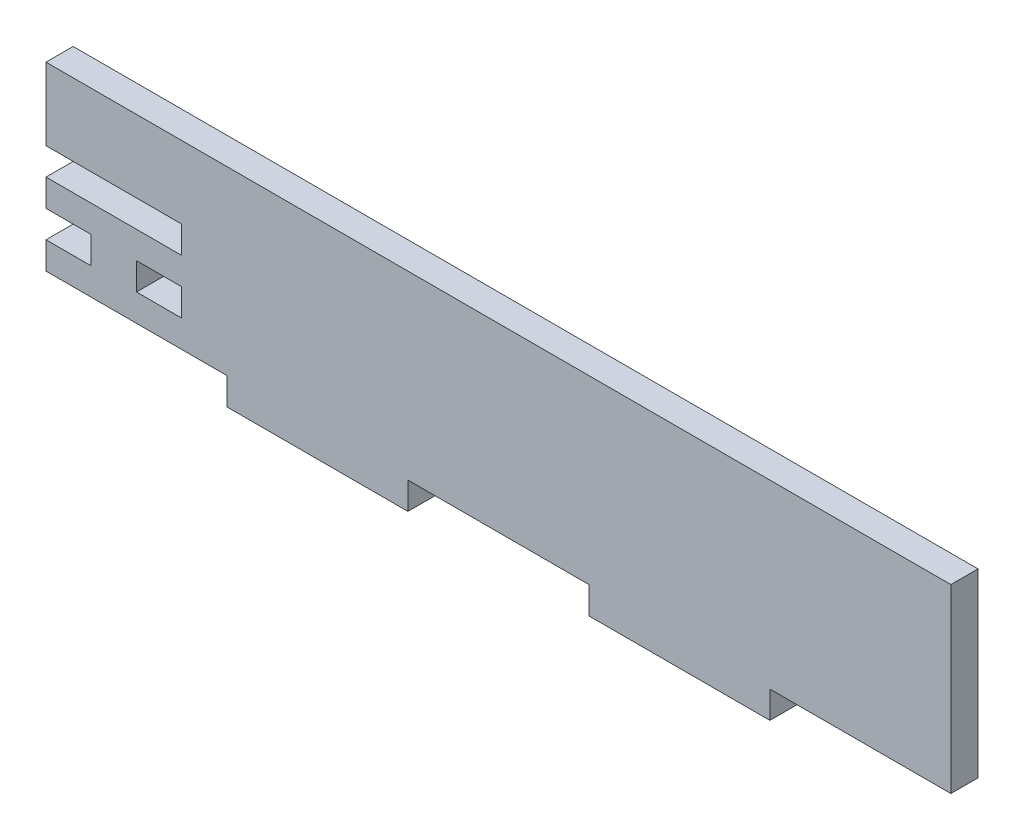
ISO-10303-21;
HEADER;
FILE_DESCRIPTION(('STEP AP214'),'2;1');
FILE_NAME('part.step','',(''),(''),'','','');
FILE_SCHEMA(('AUTOMOTIVE_DESIGN { 1 0 10303 214 1 1 1 1 }'));
ENDSEC;
DATA;
#1=APPLICATION_CONTEXT('core data for automotive mechanical design processes');
#2=APPLICATION_PROTOCOL_DEFINITION('international standard','automotive_design',2000,#1);
#3=PRODUCT_CONTEXT('',#1,'mechanical');
#4=PRODUCT('Part','Part','',(#3));
#5=PRODUCT_RELATED_PRODUCT_CATEGORY('part','',(#4));
#6=PRODUCT_DEFINITION_FORMATION('','',#4);
#7=PRODUCT_DEFINITION_CONTEXT('part definition',#1,'design');
#8=PRODUCT_DEFINITION('design','',#6,#7);
#9=PRODUCT_DEFINITION_SHAPE('','',#8);
#10=(LENGTH_UNIT() NAMED_UNIT(*) SI_UNIT(.MILLI.,.METRE.));
#11=(NAMED_UNIT(*) PLANE_ANGLE_UNIT() SI_UNIT($,.RADIAN.));
#12=(NAMED_UNIT(*) SI_UNIT($,.STERADIAN.) SOLID_ANGLE_UNIT());
#13=UNCERTAINTY_MEASURE_WITH_UNIT(LENGTH_MEASURE(1.E-05),#10,'distance_accuracy_value','');
#14=(GEOMETRIC_REPRESENTATION_CONTEXT(3) GLOBAL_UNCERTAINTY_ASSIGNED_CONTEXT((#13)) GLOBAL_UNIT_ASSIGNED_CONTEXT((#10,
#11,#12)) REPRESENTATION_CONTEXT('',''));
#15=CARTESIAN_POINT('',(0.,0.,0.));
#16=DIRECTION('',(0.,0.,1.));
#17=DIRECTION('',(1.,0.,0.));
#18=AXIS2_PLACEMENT_3D('',#15,#16,#17);
#19=CARTESIAN_POINT('',(-100.,23.,6.));
#20=DIRECTION('',(1.,0.,0.));
#21=DIRECTION('',(0.,0.,-1.));
#22=AXIS2_PLACEMENT_3D('',#19,#20,#21);
#23=PLANE('',#22);
#24=DIRECTION('',(0.,-1.,0.));
#25=VECTOR('',#24,1.);
#26=CARTESIAN_POINT('',(-100.,23.,0.));
#27=LINE('',#26,#25);
#28=CARTESIAN_POINT('',(-100.,23.,0.));
#29=VERTEX_POINT('',#28);
#30=CARTESIAN_POINT('',(-100.,7.,0.));
#31=VERTEX_POINT('',#30);
#32=EDGE_CURVE('E251',#29,#31,#27,.T.);
#33=ORIENTED_EDGE('',*,*,#32,.T.);
#34=DIRECTION('',(0.,0.,1.));
#35=VECTOR('',#34,1.);
#36=CARTESIAN_POINT('',(-100.,7.,-4.));
#37=LINE('',#36,#35);
#38=CARTESIAN_POINT('',(-100.,7.,6.));
#39=VERTEX_POINT('',#38);
#40=EDGE_CURVE('E309',#31,#39,#37,.T.);
#41=ORIENTED_EDGE('',*,*,#40,.T.);
#42=DIRECTION('',(0.,-1.,0.));
#43=VECTOR('',#42,1.);
#44=CARTESIAN_POINT('',(-100.,23.,6.));
#45=LINE('',#44,#43);
#46=CARTESIAN_POINT('',(-100.,23.,6.));
#47=VERTEX_POINT('',#46);
#48=EDGE_CURVE('E228',#47,#39,#45,.T.);
#49=ORIENTED_EDGE('',*,*,#48,.F.);
#50=DIRECTION('',(0.,0.,-1.));
#51=VECTOR('',#50,1.);
#52=CARTESIAN_POINT('',(-100.,23.,6.));
#53=LINE('',#52,#51);
#54=EDGE_CURVE('E261',#47,#29,#53,.T.);
#55=ORIENTED_EDGE('',*,*,#54,.T.);
#56=EDGE_LOOP('',(#33,#41,#49,#55));
#57=FACE_BOUND('',#56,.T.);
#58=ADVANCED_FACE('F38',(#57),#23,.F.);
#59=CARTESIAN_POINT('',(-100.,0.999999999999994,6.));
#60=VERTEX_POINT('',#59);
#61=CARTESIAN_POINT('',(-100.,-5.00000000000001,6.));
#62=VERTEX_POINT('',#61);
#63=EDGE_CURVE('E217',#60,#62,#45,.T.);
#64=ORIENTED_EDGE('',*,*,#63,.F.);
#65=DIRECTION('',(0.,0.,1.));
#66=VECTOR('',#65,1.);
#67=CARTESIAN_POINT('',(-100.,0.999999999999994,-4.));
#68=LINE('',#67,#66);
#69=CARTESIAN_POINT('',(-100.,0.999999999999994,0.));
#70=VERTEX_POINT('',#69);
#71=EDGE_CURVE('E199',#70,#60,#68,.T.);
#72=ORIENTED_EDGE('',*,*,#71,.F.);
#73=CARTESIAN_POINT('',(-100.,-5.00000000000001,0.));
#74=VERTEX_POINT('',#73);
#75=EDGE_CURVE('E256',#70,#74,#27,.T.);
#76=ORIENTED_EDGE('',*,*,#75,.T.);
#77=DIRECTION('',(0.,0.,1.));
#78=VECTOR('',#77,1.);
#79=CARTESIAN_POINT('',(-100.,-5.00000000000001,-4.));
#80=LINE('',#79,#78);
#81=EDGE_CURVE('E226',#74,#62,#80,.T.);
#82=ORIENTED_EDGE('',*,*,#81,.T.);
#83=EDGE_LOOP('',(#64,#72,#76,#82));
#84=FACE_BOUND('',#83,.T.);
#85=ADVANCED_FACE('F224',(#84),#23,.F.);
#86=CARTESIAN_POINT('',(-100.,-23.,6.));
#87=DIRECTION('',(0.,1.,0.));
#88=DIRECTION('',(0.,0.,1.));
#89=AXIS2_PLACEMENT_3D('',#86,#87,#88);
#90=PLANE('',#89);
#91=DIRECTION('',(1.,0.,0.));
#92=VECTOR('',#91,1.);
#93=CARTESIAN_POINT('',(-100.,-23.,6.));
#94=LINE('',#93,#92);
#95=CARTESIAN_POINT('',(-60.,-23.,6.));
#96=VERTEX_POINT('',#95);
#97=CARTESIAN_POINT('',(-20.,-23.,6.));
#98=VERTEX_POINT('',#97);
#99=EDGE_CURVE('E242',#96,#98,#94,.T.);
#100=ORIENTED_EDGE('',*,*,#99,.F.);
#101=DIRECTION('',(0.,0.,1.));
#102=VECTOR('',#101,1.);
#103=CARTESIAN_POINT('',(-60.,-23.,0.));
#104=LINE('',#103,#102);
#105=CARTESIAN_POINT('',(-60.,-23.,0.));
#106=VERTEX_POINT('',#105);
#107=EDGE_CURVE('E376',#106,#96,#104,.T.);
#108=ORIENTED_EDGE('',*,*,#107,.F.);
#109=DIRECTION('',(1.,0.,0.));
#110=VECTOR('',#109,1.);
#111=CARTESIAN_POINT('',(-100.,-23.,0.));
#112=LINE('',#111,#110);
#113=CARTESIAN_POINT('',(-20.,-23.,0.));
#114=VERTEX_POINT('',#113);
#115=EDGE_CURVE('E260',#106,#114,#112,.T.);
#116=ORIENTED_EDGE('',*,*,#115,.T.);
#117=DIRECTION('',(0.,0.,1.));
#118=VECTOR('',#117,1.);
#119=CARTESIAN_POINT('',(-20.,-23.,0.));
#120=LINE('',#119,#118);
#121=EDGE_CURVE('E381',#114,#98,#120,.T.);
#122=ORIENTED_EDGE('',*,*,#121,.T.);
#123=EDGE_LOOP('',(#100,#108,#116,#122));
#124=FACE_BOUND('',#123,.T.);
#125=ADVANCED_FACE('F463',(#124),#90,.F.);
#126=CARTESIAN_POINT('',(100.,23.,6.));
#127=DIRECTION('',(-1.,0.,0.));
#128=DIRECTION('',(0.,0.,1.));
#129=AXIS2_PLACEMENT_3D('',#126,#127,#128);
#130=PLANE('',#129);
#131=DIRECTION('',(0.,1.,0.));
#132=VECTOR('',#131,1.);
#133=CARTESIAN_POINT('',(100.,23.,6.));
#134=LINE('',#133,#132);
#135=CARTESIAN_POINT('',(100.,-17.,6.));
#136=VERTEX_POINT('',#135);
#137=CARTESIAN_POINT('',(100.,23.,6.));
#138=VERTEX_POINT('',#137);
#139=EDGE_CURVE('E451',#136,#138,#134,.T.);
#140=ORIENTED_EDGE('',*,*,#139,.F.);
#141=DIRECTION('',(0.,0.,1.));
#142=VECTOR('',#141,1.);
#143=CARTESIAN_POINT('',(100.,-17.,0.));
#144=LINE('',#143,#142);
#145=CARTESIAN_POINT('',(100.,-17.,0.));
#146=VERTEX_POINT('',#145);
#147=EDGE_CURVE('E438',#146,#136,#144,.T.);
#148=ORIENTED_EDGE('',*,*,#147,.F.);
#149=DIRECTION('',(0.,1.,0.));
#150=VECTOR('',#149,1.);
#151=CARTESIAN_POINT('',(100.,23.,0.));
#152=LINE('',#151,#150);
#153=CARTESIAN_POINT('',(100.,23.,0.));
#154=VERTEX_POINT('',#153);
#155=EDGE_CURVE('E243',#146,#154,#152,.T.);
#156=ORIENTED_EDGE('',*,*,#155,.T.);
#157=DIRECTION('',(0.,0.,-1.));
#158=VECTOR('',#157,1.);
#159=CARTESIAN_POINT('',(100.,23.,6.));
#160=LINE('',#159,#158);
#161=EDGE_CURVE('E265',#138,#154,#160,.T.);
#162=ORIENTED_EDGE('',*,*,#161,.F.);
#163=EDGE_LOOP('',(#140,#148,#156,#162));
#164=FACE_BOUND('',#163,.T.);
#165=ADVANCED_FACE('F40',(#164),#130,.F.);
#166=CARTESIAN_POINT('',(-100.,23.,6.));
#167=DIRECTION('',(0.,-1.,0.));
#168=DIRECTION('',(0.,0.,-1.));
#169=AXIS2_PLACEMENT_3D('',#166,#167,#168);
#170=PLANE('',#169);
#171=DIRECTION('',(-1.,0.,0.));
#172=VECTOR('',#171,1.);
#173=CARTESIAN_POINT('',(-100.,23.,0.));
#174=LINE('',#173,#172);
#175=EDGE_CURVE('E246',#154,#29,#174,.T.);
#176=ORIENTED_EDGE('',*,*,#175,.T.);
#177=ORIENTED_EDGE('',*,*,#54,.F.);
#178=DIRECTION('',(-1.,0.,0.));
#179=VECTOR('',#178,1.);
#180=CARTESIAN_POINT('',(-100.,23.,6.));
#181=LINE('',#180,#179);
#182=EDGE_CURVE('E235',#138,#47,#181,.T.);
#183=ORIENTED_EDGE('',*,*,#182,.F.);
#184=ORIENTED_EDGE('',*,*,#161,.T.);
#185=EDGE_LOOP('',(#176,#177,#183,#184));
#186=FACE_BOUND('',#185,.T.);
#187=ADVANCED_FACE('F517',(#186),#170,.F.);
#188=CARTESIAN_POINT('',(-100.,-11.,6.));
#189=VERTEX_POINT('',#188);
#190=CARTESIAN_POINT('',(-100.,-17.,6.));
#191=VERTEX_POINT('',#190);
#192=EDGE_CURVE('E229',#189,#191,#45,.T.);
#193=ORIENTED_EDGE('',*,*,#192,.F.);
#194=DIRECTION('',(0.,0.,1.));
#195=VECTOR('',#194,1.);
#196=CARTESIAN_POINT('',(-100.,-11.,-4.));
#197=LINE('',#196,#195);
#198=CARTESIAN_POINT('',(-100.,-11.,0.));
#199=VERTEX_POINT('',#198);
#200=EDGE_CURVE('E330',#199,#189,#197,.T.);
#201=ORIENTED_EDGE('',*,*,#200,.F.);
#202=CARTESIAN_POINT('',(-100.,-17.,0.));
#203=VERTEX_POINT('',#202);
#204=EDGE_CURVE('E250',#199,#203,#27,.T.);
#205=ORIENTED_EDGE('',*,*,#204,.T.);
#206=DIRECTION('',(0.,0.,1.));
#207=VECTOR('',#206,1.);
#208=CARTESIAN_POINT('',(-100.,-17.,0.));
#209=LINE('',#208,#207);
#210=EDGE_CURVE('E247',#203,#191,#209,.T.);
#211=ORIENTED_EDGE('',*,*,#210,.T.);
#212=EDGE_LOOP('',(#193,#201,#205,#211));
#213=FACE_BOUND('',#212,.T.);
#214=ADVANCED_FACE('F495',(#213),#23,.F.);
#215=CARTESIAN_POINT('',(20.,-23.,6.));
#216=VERTEX_POINT('',#215);
#217=CARTESIAN_POINT('',(60.,-23.,6.));
#218=VERTEX_POINT('',#217);
#219=EDGE_CURVE('E234',#216,#218,#94,.T.);
#220=ORIENTED_EDGE('',*,*,#219,.F.);
#221=DIRECTION('',(0.,0.,1.));
#222=VECTOR('',#221,1.);
#223=CARTESIAN_POINT('',(20.,-23.,0.));
#224=LINE('',#223,#222);
#225=CARTESIAN_POINT('',(20.,-23.,0.));
#226=VERTEX_POINT('',#225);
#227=EDGE_CURVE('E406',#226,#216,#224,.T.);
#228=ORIENTED_EDGE('',*,*,#227,.F.);
#229=CARTESIAN_POINT('',(60.,-23.,0.));
#230=VERTEX_POINT('',#229);
#231=EDGE_CURVE('E255',#226,#230,#112,.T.);
#232=ORIENTED_EDGE('',*,*,#231,.T.);
#233=DIRECTION('',(0.,0.,1.));
#234=VECTOR('',#233,1.);
#235=CARTESIAN_POINT('',(60.,-23.,0.));
#236=LINE('',#235,#234);
#237=EDGE_CURVE('E412',#230,#218,#236,.T.);
#238=ORIENTED_EDGE('',*,*,#237,.T.);
#239=EDGE_LOOP('',(#220,#228,#232,#238));
#240=FACE_BOUND('',#239,.T.);
#241=ADVANCED_FACE('F516',(#240),#90,.F.);
#242=CARTESIAN_POINT('',(0.,0.,6.));
#243=DIRECTION('',(0.,0.,1.));
#244=DIRECTION('',(1.,0.,0.));
#245=AXIS2_PLACEMENT_3D('',#242,#243,#244);
#246=PLANE('',#245);
#247=DIRECTION('',(-1.,0.,0.));
#248=VECTOR('',#247,1.);
#249=CARTESIAN_POINT('',(-100.,7.,6.));
#250=LINE('',#249,#248);
#251=CARTESIAN_POINT('',(-70.,6.99999999999999,6.));
#252=VERTEX_POINT('',#251);
#253=EDGE_CURVE('E210',#252,#39,#250,.T.);
#254=ORIENTED_EDGE('',*,*,#253,.F.);
#255=DIRECTION('',(0.,1.,0.));
#256=VECTOR('',#255,1.);
#257=CARTESIAN_POINT('',(-70.,6.99999999999999,6.));
#258=LINE('',#257,#256);
#259=CARTESIAN_POINT('',(-70.,0.999999999999994,6.));
#260=VERTEX_POINT('',#259);
#261=EDGE_CURVE('E220',#260,#252,#258,.T.);
#262=ORIENTED_EDGE('',*,*,#261,.F.);
#263=DIRECTION('',(1.,0.,0.));
#264=VECTOR('',#263,1.);
#265=CARTESIAN_POINT('',(-100.,0.999999999999994,6.));
#266=LINE('',#265,#264);
#267=EDGE_CURVE('E202',#60,#260,#266,.T.);
#268=ORIENTED_EDGE('',*,*,#267,.F.);
#269=ORIENTED_EDGE('',*,*,#63,.T.);
#270=DIRECTION('',(-1.,0.,0.));
#271=VECTOR('',#270,1.);
#272=CARTESIAN_POINT('',(-100.,-5.00000000000001,6.));
#273=LINE('',#272,#271);
#274=CARTESIAN_POINT('',(-90.,-5.00000000000001,6.));
#275=VERTEX_POINT('',#274);
#276=EDGE_CURVE('E327',#275,#62,#273,.T.);
#277=ORIENTED_EDGE('',*,*,#276,.F.);
#278=DIRECTION('',(0.,1.,0.));
#279=VECTOR('',#278,1.);
#280=CARTESIAN_POINT('',(-90.,-11.,6.));
#281=LINE('',#280,#279);
#282=CARTESIAN_POINT('',(-90.,-11.,6.));
#283=VERTEX_POINT('',#282);
#284=EDGE_CURVE('E322',#283,#275,#281,.T.);
#285=ORIENTED_EDGE('',*,*,#284,.F.);
#286=DIRECTION('',(1.,0.,0.));
#287=VECTOR('',#286,1.);
#288=CARTESIAN_POINT('',(-100.,-11.,6.));
#289=LINE('',#288,#287);
#290=EDGE_CURVE('E318',#189,#283,#289,.T.);
#291=ORIENTED_EDGE('',*,*,#290,.F.);
#292=ORIENTED_EDGE('',*,*,#192,.T.);
#293=DIRECTION('',(-1.,0.,0.));
#294=VECTOR('',#293,1.);
#295=CARTESIAN_POINT('',(-100.,-17.,6.));
#296=LINE('',#295,#294);
#297=CARTESIAN_POINT('',(-60.,-17.,6.));
#298=VERTEX_POINT('',#297);
#299=EDGE_CURVE('E372',#298,#191,#296,.T.);
#300=ORIENTED_EDGE('',*,*,#299,.F.);
#301=DIRECTION('',(0.,1.,0.));
#302=VECTOR('',#301,1.);
#303=CARTESIAN_POINT('',(-60.,-23.,6.));
#304=LINE('',#303,#302);
#305=EDGE_CURVE('E377',#96,#298,#304,.T.);
#306=ORIENTED_EDGE('',*,*,#305,.F.);
#307=ORIENTED_EDGE('',*,*,#99,.T.);
#308=DIRECTION('',(0.,-1.,0.));
#309=VECTOR('',#308,1.);
#310=CARTESIAN_POINT('',(-20.,-23.,6.));
#311=LINE('',#310,#309);
#312=CARTESIAN_POINT('',(-20.,-17.,6.));
#313=VERTEX_POINT('',#312);
#314=EDGE_CURVE('E398',#313,#98,#311,.T.);
#315=ORIENTED_EDGE('',*,*,#314,.F.);
#316=DIRECTION('',(-1.,0.,0.));
#317=VECTOR('',#316,1.);
#318=CARTESIAN_POINT('',(-20.,-17.,6.));
#319=LINE('',#318,#317);
#320=CARTESIAN_POINT('',(20.,-17.,6.));
#321=VERTEX_POINT('',#320);
#322=EDGE_CURVE('E411',#321,#313,#319,.T.);
#323=ORIENTED_EDGE('',*,*,#322,.F.);
#324=DIRECTION('',(0.,1.,0.));
#325=VECTOR('',#324,1.);
#326=CARTESIAN_POINT('',(20.,-23.,6.));
#327=LINE('',#326,#325);
#328=EDGE_CURVE('E407',#216,#321,#327,.T.);
#329=ORIENTED_EDGE('',*,*,#328,.F.);
#330=ORIENTED_EDGE('',*,*,#219,.T.);
#331=DIRECTION('',(0.,-1.,0.));
#332=VECTOR('',#331,1.);
#333=CARTESIAN_POINT('',(60.,-23.,6.));
#334=LINE('',#333,#332);
#335=CARTESIAN_POINT('',(60.,-17.,6.));
#336=VERTEX_POINT('',#335);
#337=EDGE_CURVE('E434',#336,#218,#334,.T.);
#338=ORIENTED_EDGE('',*,*,#337,.F.);
#339=DIRECTION('',(-1.,0.,0.));
#340=VECTOR('',#339,1.);
#341=CARTESIAN_POINT('',(60.,-17.,6.));
#342=LINE('',#341,#340);
#343=EDGE_CURVE('E333',#136,#336,#342,.T.);
#344=ORIENTED_EDGE('',*,*,#343,.F.);
#345=ORIENTED_EDGE('',*,*,#139,.T.);
#346=ORIENTED_EDGE('',*,*,#182,.T.);
#347=ORIENTED_EDGE('',*,*,#48,.T.);
#348=EDGE_LOOP('',(#254,#262,#268,#269,#277,#285,#291,#292,#300,#306,#307,#315,#323,#329,#330,
#338,#344,#345,#346,#347));
#349=FACE_BOUND('',#348,.T.);
#350=DIRECTION('',(1.,0.,0.));
#351=VECTOR('',#350,1.);
#352=CARTESIAN_POINT('',(-80.,-11.,6.));
#353=LINE('',#352,#351);
#354=CARTESIAN_POINT('',(-80.,-11.,6.));
#355=VERTEX_POINT('',#354);
#356=CARTESIAN_POINT('',(-70.,-11.,6.));
#357=VERTEX_POINT('',#356);
#358=EDGE_CURVE('E62',#355,#357,#353,.T.);
#359=ORIENTED_EDGE('',*,*,#358,.F.);
#360=DIRECTION('',(0.,-1.,0.));
#361=VECTOR('',#360,1.);
#362=CARTESIAN_POINT('',(-80.,-11.,6.));
#363=LINE('',#362,#361);
#364=CARTESIAN_POINT('',(-80.,-5.00000000000001,6.));
#365=VERTEX_POINT('',#364);
#366=EDGE_CURVE('E352',#365,#355,#363,.T.);
#367=ORIENTED_EDGE('',*,*,#366,.F.);
#368=DIRECTION('',(-1.,0.,0.));
#369=VECTOR('',#368,1.);
#370=CARTESIAN_POINT('',(-80.,-5.00000000000001,6.));
#371=LINE('',#370,#369);
#372=CARTESIAN_POINT('',(-70.,-5.00000000000001,6.));
#373=VERTEX_POINT('',#372);
#374=EDGE_CURVE('E348',#373,#365,#371,.T.);
#375=ORIENTED_EDGE('',*,*,#374,.F.);
#376=DIRECTION('',(0.,1.,0.));
#377=VECTOR('',#376,1.);
#378=CARTESIAN_POINT('',(-70.,-11.,6.));
#379=LINE('',#378,#377);
#380=EDGE_CURVE('E344',#357,#373,#379,.T.);
#381=ORIENTED_EDGE('',*,*,#380,.F.);
#382=EDGE_LOOP('',(#359,#367,#375,#381));
#383=FACE_BOUND('',#382,.T.);
#384=ADVANCED_FACE('F214',(#349,#383),#246,.T.);
#385=CARTESIAN_POINT('',(0.,0.,0.));
#386=DIRECTION('',(0.,0.,1.));
#387=DIRECTION('',(1.,0.,0.));
#388=AXIS2_PLACEMENT_3D('',#385,#386,#387);
#389=PLANE('',#388);
#390=DIRECTION('',(0.,-1.,0.));
#391=VECTOR('',#390,1.);
#392=CARTESIAN_POINT('',(-80.,0.,0.));
#393=LINE('',#392,#391);
#394=CARTESIAN_POINT('',(-80.,-5.00000000000001,0.));
#395=VERTEX_POINT('',#394);
#396=CARTESIAN_POINT('',(-80.,-11.,0.));
#397=VERTEX_POINT('',#396);
#398=EDGE_CURVE('E277',#395,#397,#393,.T.);
#399=ORIENTED_EDGE('',*,*,#398,.T.);
#400=DIRECTION('',(1.,0.,0.));
#401=VECTOR('',#400,1.);
#402=CARTESIAN_POINT('',(0.,-11.,0.));
#403=LINE('',#402,#401);
#404=CARTESIAN_POINT('',(-70.,-11.,0.));
#405=VERTEX_POINT('',#404);
#406=EDGE_CURVE('E281',#397,#405,#403,.T.);
#407=ORIENTED_EDGE('',*,*,#406,.T.);
#408=DIRECTION('',(0.,1.,0.));
#409=VECTOR('',#408,1.);
#410=CARTESIAN_POINT('',(-70.,0.,0.));
#411=LINE('',#410,#409);
#412=CARTESIAN_POINT('',(-70.,-5.00000000000001,0.));
#413=VERTEX_POINT('',#412);
#414=EDGE_CURVE('E269',#405,#413,#411,.T.);
#415=ORIENTED_EDGE('',*,*,#414,.T.);
#416=DIRECTION('',(-1.,0.,0.));
#417=VECTOR('',#416,1.);
#418=CARTESIAN_POINT('',(0.,-5.00000000000001,0.));
#419=LINE('',#418,#417);
#420=EDGE_CURVE('E273',#413,#395,#419,.T.);
#421=ORIENTED_EDGE('',*,*,#420,.T.);
#422=EDGE_LOOP('',(#399,#407,#415,#421));
#423=FACE_BOUND('',#422,.T.);
#424=DIRECTION('',(0.,1.,0.));
#425=VECTOR('',#424,1.);
#426=CARTESIAN_POINT('',(-70.,0.,0.));
#427=LINE('',#426,#425);
#428=CARTESIAN_POINT('',(-70.,0.999999999999994,0.));
#429=VERTEX_POINT('',#428);
#430=CARTESIAN_POINT('',(-70.,6.99999999999999,0.));
#431=VERTEX_POINT('',#430);
#432=EDGE_CURVE('E47',#429,#431,#427,.T.);
#433=ORIENTED_EDGE('',*,*,#432,.T.);
#434=DIRECTION('',(-1.,0.,0.));
#435=VECTOR('',#434,1.);
#436=CARTESIAN_POINT('',(0.,6.99999999999999,0.));
#437=LINE('',#436,#435);
#438=EDGE_CURVE('E11',#431,#31,#437,.T.);
#439=ORIENTED_EDGE('',*,*,#438,.T.);
#440=ORIENTED_EDGE('',*,*,#32,.F.);
#441=ORIENTED_EDGE('',*,*,#175,.F.);
#442=ORIENTED_EDGE('',*,*,#155,.F.);
#443=DIRECTION('',(-1.,0.,0.));
#444=VECTOR('',#443,1.);
#445=CARTESIAN_POINT('',(60.,-17.,0.));
#446=LINE('',#445,#444);
#447=CARTESIAN_POINT('',(60.,-17.,0.));
#448=VERTEX_POINT('',#447);
#449=EDGE_CURVE('E429',#146,#448,#446,.T.);
#450=ORIENTED_EDGE('',*,*,#449,.T.);
#451=DIRECTION('',(0.,-1.,0.));
#452=VECTOR('',#451,1.);
#453=CARTESIAN_POINT('',(60.,-23.,0.));
#454=LINE('',#453,#452);
#455=EDGE_CURVE('E433',#448,#230,#454,.T.);
#456=ORIENTED_EDGE('',*,*,#455,.T.);
#457=ORIENTED_EDGE('',*,*,#231,.F.);
#458=DIRECTION('',(0.,1.,0.));
#459=VECTOR('',#458,1.);
#460=CARTESIAN_POINT('',(20.,-23.,0.));
#461=LINE('',#460,#459);
#462=CARTESIAN_POINT('',(20.,-17.,0.));
#463=VERTEX_POINT('',#462);
#464=EDGE_CURVE('E393',#226,#463,#461,.T.);
#465=ORIENTED_EDGE('',*,*,#464,.T.);
#466=DIRECTION('',(-1.,0.,0.));
#467=VECTOR('',#466,1.);
#468=CARTESIAN_POINT('',(-20.,-17.,0.));
#469=LINE('',#468,#467);
#470=CARTESIAN_POINT('',(-20.,-17.,0.));
#471=VERTEX_POINT('',#470);
#472=EDGE_CURVE('E397',#463,#471,#469,.T.);
#473=ORIENTED_EDGE('',*,*,#472,.T.);
#474=DIRECTION('',(0.,-1.,0.));
#475=VECTOR('',#474,1.);
#476=CARTESIAN_POINT('',(-20.,-23.,0.));
#477=LINE('',#476,#475);
#478=EDGE_CURVE('E402',#471,#114,#477,.T.);
#479=ORIENTED_EDGE('',*,*,#478,.T.);
#480=ORIENTED_EDGE('',*,*,#115,.F.);
#481=DIRECTION('',(0.,1.,0.));
#482=VECTOR('',#481,1.);
#483=CARTESIAN_POINT('',(-60.,-23.,0.));
#484=LINE('',#483,#482);
#485=CARTESIAN_POINT('',(-60.,-17.,0.));
#486=VERTEX_POINT('',#485);
#487=EDGE_CURVE('E367',#106,#486,#484,.T.);
#488=ORIENTED_EDGE('',*,*,#487,.T.);
#489=DIRECTION('',(-1.,0.,0.));
#490=VECTOR('',#489,1.);
#491=CARTESIAN_POINT('',(-100.,-17.,0.));
#492=LINE('',#491,#490);
#493=EDGE_CURVE('E371',#486,#203,#492,.T.);
#494=ORIENTED_EDGE('',*,*,#493,.T.);
#495=ORIENTED_EDGE('',*,*,#204,.F.);
#496=DIRECTION('',(1.,0.,0.));
#497=VECTOR('',#496,1.);
#498=CARTESIAN_POINT('',(0.,-11.,0.));
#499=LINE('',#498,#497);
#500=CARTESIAN_POINT('',(-90.,-11.,0.));
#501=VERTEX_POINT('',#500);
#502=EDGE_CURVE('E285',#199,#501,#499,.T.);
#503=ORIENTED_EDGE('',*,*,#502,.T.);
#504=DIRECTION('',(0.,1.,0.));
#505=VECTOR('',#504,1.);
#506=CARTESIAN_POINT('',(-90.,0.,0.));
#507=LINE('',#506,#505);
#508=CARTESIAN_POINT('',(-90.,-5.00000000000001,0.));
#509=VERTEX_POINT('',#508);
#510=EDGE_CURVE('E289',#501,#509,#507,.T.);
#511=ORIENTED_EDGE('',*,*,#510,.T.);
#512=DIRECTION('',(-1.,0.,0.));
#513=VECTOR('',#512,1.);
#514=CARTESIAN_POINT('',(0.,-5.00000000000001,0.));
#515=LINE('',#514,#513);
#516=EDGE_CURVE('E293',#509,#74,#515,.T.);
#517=ORIENTED_EDGE('',*,*,#516,.T.);
#518=ORIENTED_EDGE('',*,*,#75,.F.);
#519=DIRECTION('',(1.,0.,0.));
#520=VECTOR('',#519,1.);
#521=CARTESIAN_POINT('',(0.,0.999999999999994,0.));
#522=LINE('',#521,#520);
#523=EDGE_CURVE('E205',#70,#429,#522,.T.);
#524=ORIENTED_EDGE('',*,*,#523,.T.);
#525=EDGE_LOOP('',(#433,#439,#440,#441,#442,#450,#456,#457,#465,#473,#479,#480,#488,#494,#495,
#503,#511,#517,#518,#524));
#526=FACE_BOUND('',#525,.T.);
#527=ADVANCED_FACE('F301',(#423,#526),#389,.F.);
#528=CARTESIAN_POINT('',(60.,-23.,0.));
#529=DIRECTION('',(-1.,0.,0.));
#530=DIRECTION('',(0.,0.,1.));
#531=AXIS2_PLACEMENT_3D('',#528,#529,#530);
#532=PLANE('',#531);
#533=ORIENTED_EDGE('',*,*,#337,.T.);
#534=ORIENTED_EDGE('',*,*,#237,.F.);
#535=ORIENTED_EDGE('',*,*,#455,.F.);
#536=DIRECTION('',(0.,0.,1.));
#537=VECTOR('',#536,1.);
#538=CARTESIAN_POINT('',(60.,-17.,0.));
#539=LINE('',#538,#537);
#540=EDGE_CURVE('E447',#448,#336,#539,.T.);
#541=ORIENTED_EDGE('',*,*,#540,.T.);
#542=EDGE_LOOP('',(#533,#534,#535,#541));
#543=FACE_BOUND('',#542,.T.);
#544=ADVANCED_FACE('F540',(#543),#532,.F.);
#545=CARTESIAN_POINT('',(60.,-17.,0.));
#546=DIRECTION('',(0.,1.,0.));
#547=DIRECTION('',(-1.,0.,0.));
#548=AXIS2_PLACEMENT_3D('',#545,#546,#547);
#549=PLANE('',#548);
#550=ORIENTED_EDGE('',*,*,#343,.T.);
#551=ORIENTED_EDGE('',*,*,#540,.F.);
#552=ORIENTED_EDGE('',*,*,#449,.F.);
#553=ORIENTED_EDGE('',*,*,#147,.T.);
#554=EDGE_LOOP('',(#550,#551,#552,#553));
#555=FACE_BOUND('',#554,.T.);
#556=ADVANCED_FACE('F537',(#555),#549,.F.);
#557=CARTESIAN_POINT('',(-20.,-23.,0.));
#558=DIRECTION('',(-1.,0.,0.));
#559=DIRECTION('',(0.,0.,1.));
#560=AXIS2_PLACEMENT_3D('',#557,#558,#559);
#561=PLANE('',#560);
#562=ORIENTED_EDGE('',*,*,#314,.T.);
#563=ORIENTED_EDGE('',*,*,#121,.F.);
#564=ORIENTED_EDGE('',*,*,#478,.F.);
#565=DIRECTION('',(0.,0.,1.));
#566=VECTOR('',#565,1.);
#567=CARTESIAN_POINT('',(-20.,-17.,0.));
#568=LINE('',#567,#566);
#569=EDGE_CURVE('E421',#471,#313,#568,.T.);
#570=ORIENTED_EDGE('',*,*,#569,.T.);
#571=EDGE_LOOP('',(#562,#563,#564,#570));
#572=FACE_BOUND('',#571,.T.);
#573=ADVANCED_FACE('F467',(#572),#561,.F.);
#574=CARTESIAN_POINT('',(-20.,-17.,0.));
#575=DIRECTION('',(0.,1.,0.));
#576=DIRECTION('',(-1.,0.,0.));
#577=AXIS2_PLACEMENT_3D('',#574,#575,#576);
#578=PLANE('',#577);
#579=ORIENTED_EDGE('',*,*,#322,.T.);
#580=ORIENTED_EDGE('',*,*,#569,.F.);
#581=ORIENTED_EDGE('',*,*,#472,.F.);
#582=DIRECTION('',(0.,0.,1.));
#583=VECTOR('',#582,1.);
#584=CARTESIAN_POINT('',(20.,-17.,0.));
#585=LINE('',#584,#583);
#586=EDGE_CURVE('E424',#463,#321,#585,.T.);
#587=ORIENTED_EDGE('',*,*,#586,.T.);
#588=EDGE_LOOP('',(#579,#580,#581,#587));
#589=FACE_BOUND('',#588,.T.);
#590=ADVANCED_FACE('F547',(#589),#578,.F.);
#591=CARTESIAN_POINT('',(20.,-23.,0.));
#592=DIRECTION('',(1.,0.,0.));
#593=DIRECTION('',(0.,0.,-1.));
#594=AXIS2_PLACEMENT_3D('',#591,#592,#593);
#595=PLANE('',#594);
#596=ORIENTED_EDGE('',*,*,#328,.T.);
#597=ORIENTED_EDGE('',*,*,#586,.F.);
#598=ORIENTED_EDGE('',*,*,#464,.F.);
#599=ORIENTED_EDGE('',*,*,#227,.T.);
#600=EDGE_LOOP('',(#596,#597,#598,#599));
#601=FACE_BOUND('',#600,.T.);
#602=ADVANCED_FACE('F545',(#601),#595,.F.);
#603=CARTESIAN_POINT('',(-100.,-17.,0.));
#604=DIRECTION('',(0.,1.,0.));
#605=DIRECTION('',(-1.,0.,0.));
#606=AXIS2_PLACEMENT_3D('',#603,#604,#605);
#607=PLANE('',#606);
#608=ORIENTED_EDGE('',*,*,#299,.T.);
#609=ORIENTED_EDGE('',*,*,#210,.F.);
#610=ORIENTED_EDGE('',*,*,#493,.F.);
#611=DIRECTION('',(0.,0.,1.));
#612=VECTOR('',#611,1.);
#613=CARTESIAN_POINT('',(-60.,-17.,0.));
#614=LINE('',#613,#612);
#615=EDGE_CURVE('E388',#486,#298,#614,.T.);
#616=ORIENTED_EDGE('',*,*,#615,.T.);
#617=EDGE_LOOP('',(#608,#609,#610,#616));
#618=FACE_BOUND('',#617,.T.);
#619=ADVANCED_FACE('F478',(#618),#607,.F.);
#620=CARTESIAN_POINT('',(-60.,-23.,0.));
#621=DIRECTION('',(1.,0.,0.));
#622=DIRECTION('',(0.,0.,-1.));
#623=AXIS2_PLACEMENT_3D('',#620,#621,#622);
#624=PLANE('',#623);
#625=ORIENTED_EDGE('',*,*,#305,.T.);
#626=ORIENTED_EDGE('',*,*,#615,.F.);
#627=ORIENTED_EDGE('',*,*,#487,.F.);
#628=ORIENTED_EDGE('',*,*,#107,.T.);
#629=EDGE_LOOP('',(#625,#626,#627,#628));
#630=FACE_BOUND('',#629,.T.);
#631=ADVANCED_FACE('F476',(#630),#624,.F.);
#632=CARTESIAN_POINT('',(-80.,-11.,-4.));
#633=DIRECTION('',(0.,-1.,0.));
#634=DIRECTION('',(1.,0.,0.));
#635=AXIS2_PLACEMENT_3D('',#632,#633,#634);
#636=PLANE('',#635);
#637=DIRECTION('',(0.,0.,1.));
#638=VECTOR('',#637,1.);
#639=CARTESIAN_POINT('',(-80.,-11.,-4.));
#640=LINE('',#639,#638);
#641=EDGE_CURVE('E323',#397,#355,#640,.T.);
#642=ORIENTED_EDGE('',*,*,#641,.T.);
#643=ORIENTED_EDGE('',*,*,#358,.T.);
#644=DIRECTION('',(0.,0.,1.));
#645=VECTOR('',#644,1.);
#646=CARTESIAN_POINT('',(-70.,-11.,-4.));
#647=LINE('',#646,#645);
#648=EDGE_CURVE('E356',#405,#357,#647,.T.);
#649=ORIENTED_EDGE('',*,*,#648,.F.);
#650=ORIENTED_EDGE('',*,*,#406,.F.);
#651=EDGE_LOOP('',(#642,#643,#649,#650));
#652=FACE_BOUND('',#651,.T.);
#653=ADVANCED_FACE('F581',(#652),#636,.F.);
#654=CARTESIAN_POINT('',(-80.,-11.,-4.));
#655=DIRECTION('',(-1.,0.,0.));
#656=DIRECTION('',(0.,0.,1.));
#657=AXIS2_PLACEMENT_3D('',#654,#655,#656);
#658=PLANE('',#657);
#659=DIRECTION('',(0.,0.,1.));
#660=VECTOR('',#659,1.);
#661=CARTESIAN_POINT('',(-80.,-5.00000000000001,-4.));
#662=LINE('',#661,#660);
#663=EDGE_CURVE('E359',#395,#365,#662,.T.);
#664=ORIENTED_EDGE('',*,*,#663,.T.);
#665=ORIENTED_EDGE('',*,*,#366,.T.);
#666=ORIENTED_EDGE('',*,*,#641,.F.);
#667=ORIENTED_EDGE('',*,*,#398,.F.);
#668=EDGE_LOOP('',(#664,#665,#666,#667));
#669=FACE_BOUND('',#668,.T.);
#670=ADVANCED_FACE('F573',(#669),#658,.F.);
#671=CARTESIAN_POINT('',(-80.,-5.00000000000001,-4.));
#672=DIRECTION('',(0.,1.,0.));
#673=DIRECTION('',(0.,0.,1.));
#674=AXIS2_PLACEMENT_3D('',#671,#672,#673);
#675=PLANE('',#674);
#676=DIRECTION('',(0.,0.,1.));
#677=VECTOR('',#676,1.);
#678=CARTESIAN_POINT('',(-70.,-5.00000000000001,-4.));
#679=LINE('',#678,#677);
#680=EDGE_CURVE('E362',#413,#373,#679,.T.);
#681=ORIENTED_EDGE('',*,*,#680,.T.);
#682=ORIENTED_EDGE('',*,*,#374,.T.);
#683=ORIENTED_EDGE('',*,*,#663,.F.);
#684=ORIENTED_EDGE('',*,*,#420,.F.);
#685=EDGE_LOOP('',(#681,#682,#683,#684));
#686=FACE_BOUND('',#685,.T.);
#687=ADVANCED_FACE('F575',(#686),#675,.F.);
#688=CARTESIAN_POINT('',(-70.,-11.,-4.));
#689=DIRECTION('',(1.,0.,0.));
#690=DIRECTION('',(0.,0.,-1.));
#691=AXIS2_PLACEMENT_3D('',#688,#689,#690);
#692=PLANE('',#691);
#693=ORIENTED_EDGE('',*,*,#648,.T.);
#694=ORIENTED_EDGE('',*,*,#380,.T.);
#695=ORIENTED_EDGE('',*,*,#680,.F.);
#696=ORIENTED_EDGE('',*,*,#414,.F.);
#697=EDGE_LOOP('',(#693,#694,#695,#696));
#698=FACE_BOUND('',#697,.T.);
#699=ADVANCED_FACE('F580',(#698),#692,.F.);
#700=CARTESIAN_POINT('',(-100.,-5.00000000000001,-4.));
#701=DIRECTION('',(0.,1.,0.));
#702=DIRECTION('',(0.,0.,1.));
#703=AXIS2_PLACEMENT_3D('',#700,#701,#702);
#704=PLANE('',#703);
#705=DIRECTION('',(0.,0.,1.));
#706=VECTOR('',#705,1.);
#707=CARTESIAN_POINT('',(-90.,-5.00000000000001,-4.));
#708=LINE('',#707,#706);
#709=EDGE_CURVE('E334',#509,#275,#708,.T.);
#710=ORIENTED_EDGE('',*,*,#709,.T.);
#711=ORIENTED_EDGE('',*,*,#276,.T.);
#712=ORIENTED_EDGE('',*,*,#81,.F.);
#713=ORIENTED_EDGE('',*,*,#516,.F.);
#714=EDGE_LOOP('',(#710,#711,#712,#713));
#715=FACE_BOUND('',#714,.T.);
#716=ADVANCED_FACE('F486',(#715),#704,.F.);
#717=CARTESIAN_POINT('',(-90.,-11.,-4.));
#718=DIRECTION('',(1.,0.,0.));
#719=DIRECTION('',(0.,0.,-1.));
#720=AXIS2_PLACEMENT_3D('',#717,#718,#719);
#721=PLANE('',#720);
#722=DIRECTION('',(0.,0.,1.));
#723=VECTOR('',#722,1.);
#724=CARTESIAN_POINT('',(-90.,-11.,-4.));
#725=LINE('',#724,#723);
#726=EDGE_CURVE('E337',#501,#283,#725,.T.);
#727=ORIENTED_EDGE('',*,*,#726,.T.);
#728=ORIENTED_EDGE('',*,*,#284,.T.);
#729=ORIENTED_EDGE('',*,*,#709,.F.);
#730=ORIENTED_EDGE('',*,*,#510,.F.);
#731=EDGE_LOOP('',(#727,#728,#729,#730));
#732=FACE_BOUND('',#731,.T.);
#733=ADVANCED_FACE('F490',(#732),#721,.F.);
#734=CARTESIAN_POINT('',(-100.,-11.,-4.));
#735=DIRECTION('',(0.,-1.,0.));
#736=DIRECTION('',(1.,0.,0.));
#737=AXIS2_PLACEMENT_3D('',#734,#735,#736);
#738=PLANE('',#737);
#739=ORIENTED_EDGE('',*,*,#200,.T.);
#740=ORIENTED_EDGE('',*,*,#290,.T.);
#741=ORIENTED_EDGE('',*,*,#726,.F.);
#742=ORIENTED_EDGE('',*,*,#502,.F.);
#743=EDGE_LOOP('',(#739,#740,#741,#742));
#744=FACE_BOUND('',#743,.T.);
#745=ADVANCED_FACE('F496',(#744),#738,.F.);
#746=CARTESIAN_POINT('',(-100.,7.,-4.));
#747=DIRECTION('',(0.,1.,0.));
#748=DIRECTION('',(-1.,0.,0.));
#749=AXIS2_PLACEMENT_3D('',#746,#747,#748);
#750=PLANE('',#749);
#751=DIRECTION('',(0.,0.,1.));
#752=VECTOR('',#751,1.);
#753=CARTESIAN_POINT('',(-70.,6.99999999999999,-4.));
#754=LINE('',#753,#752);
#755=EDGE_CURVE('E306',#431,#252,#754,.T.);
#756=ORIENTED_EDGE('',*,*,#755,.T.);
#757=ORIENTED_EDGE('',*,*,#253,.T.);
#758=ORIENTED_EDGE('',*,*,#40,.F.);
#759=ORIENTED_EDGE('',*,*,#438,.F.);
#760=EDGE_LOOP('',(#756,#757,#758,#759));
#761=FACE_BOUND('',#760,.T.);
#762=ADVANCED_FACE('F498',(#761),#750,.F.);
#763=CARTESIAN_POINT('',(-70.,6.99999999999999,-4.));
#764=DIRECTION('',(1.,0.,0.));
#765=DIRECTION('',(0.,0.,-1.));
#766=AXIS2_PLACEMENT_3D('',#763,#764,#765);
#767=PLANE('',#766);
#768=DIRECTION('',(0.,0.,1.));
#769=VECTOR('',#768,1.);
#770=CARTESIAN_POINT('',(-70.,0.999999999999994,-4.));
#771=LINE('',#770,#769);
#772=EDGE_CURVE('E54',#429,#260,#771,.T.);
#773=ORIENTED_EDGE('',*,*,#772,.T.);
#774=ORIENTED_EDGE('',*,*,#261,.T.);
#775=ORIENTED_EDGE('',*,*,#755,.F.);
#776=ORIENTED_EDGE('',*,*,#432,.F.);
#777=EDGE_LOOP('',(#773,#774,#775,#776));
#778=FACE_BOUND('',#777,.T.);
#779=ADVANCED_FACE('F305',(#778),#767,.F.);
#780=CARTESIAN_POINT('',(-100.,0.999999999999994,-4.));
#781=DIRECTION('',(0.,-1.,0.));
#782=DIRECTION('',(0.,0.,-1.));
#783=AXIS2_PLACEMENT_3D('',#780,#781,#782);
#784=PLANE('',#783);
#785=ORIENTED_EDGE('',*,*,#71,.T.);
#786=ORIENTED_EDGE('',*,*,#267,.T.);
#787=ORIENTED_EDGE('',*,*,#772,.F.);
#788=ORIENTED_EDGE('',*,*,#523,.F.);
#789=EDGE_LOOP('',(#785,#786,#787,#788));
#790=FACE_BOUND('',#789,.T.);
#791=ADVANCED_FACE('F201',(#790),#784,.F.);
#792=CLOSED_SHELL('',(#58,#85,#125,#165,#187,#214,#241,#384,#527,#544,#556,#573,#590,#602,#619,
#631,#653,#670,#687,#699,#716,#733,#745,#762,#779,#791));
#793=MANIFOLD_SOLID_BREP('B2',#792);
#794=ADVANCED_BREP_SHAPE_REPRESENTATION('',(#18,#793),#14);
#795=SHAPE_DEFINITION_REPRESENTATION(#9,#794);
ENDSEC;
END-ISO-10303-21;
